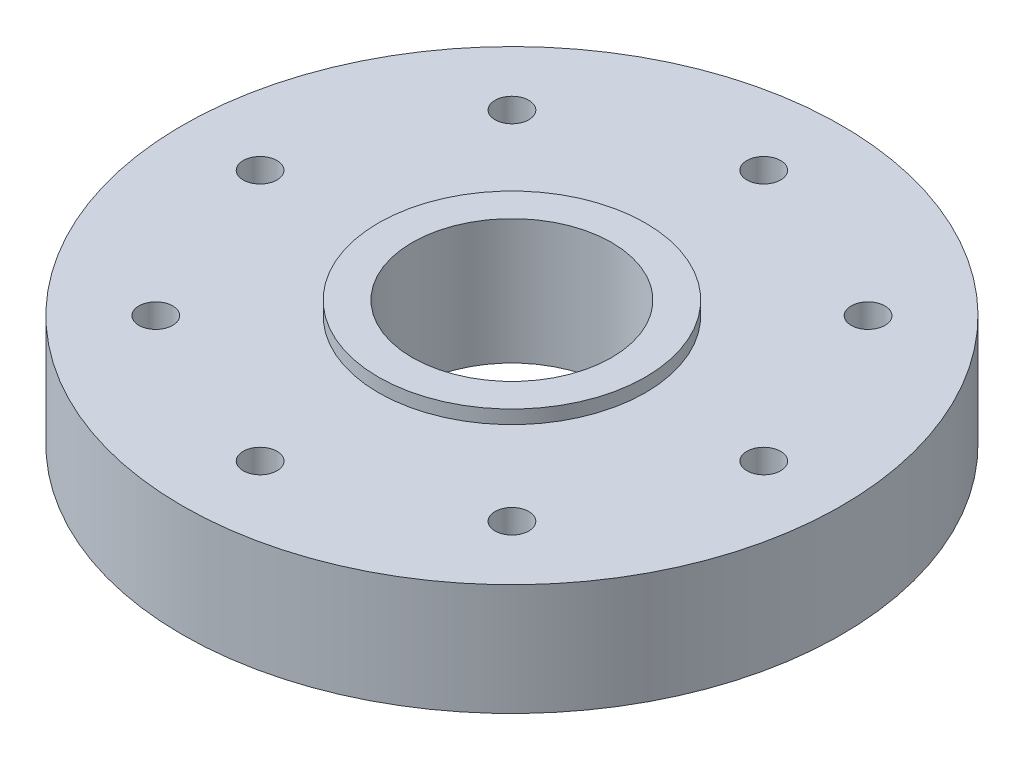
ISO-10303-21;
HEADER;
FILE_DESCRIPTION(('STEP AP214'),'2;1');
FILE_NAME('part.step','',(''),(''),'','','');
FILE_SCHEMA(('AUTOMOTIVE_DESIGN { 1 0 10303 214 1 1 1 1 }'));
ENDSEC;
DATA;
#1=APPLICATION_CONTEXT('core data for automotive mechanical design processes');
#2=APPLICATION_PROTOCOL_DEFINITION('international standard','automotive_design',2000,#1);
#3=PRODUCT_CONTEXT('',#1,'mechanical');
#4=PRODUCT('Part','Part','',(#3));
#5=PRODUCT_RELATED_PRODUCT_CATEGORY('part','',(#4));
#6=PRODUCT_DEFINITION_FORMATION('','',#4);
#7=PRODUCT_DEFINITION_CONTEXT('part definition',#1,'design');
#8=PRODUCT_DEFINITION('design','',#6,#7);
#9=PRODUCT_DEFINITION_SHAPE('','',#8);
#10=(LENGTH_UNIT() NAMED_UNIT(*) SI_UNIT(.MILLI.,.METRE.));
#11=(NAMED_UNIT(*) PLANE_ANGLE_UNIT() SI_UNIT($,.RADIAN.));
#12=(NAMED_UNIT(*) SI_UNIT($,.STERADIAN.) SOLID_ANGLE_UNIT());
#13=UNCERTAINTY_MEASURE_WITH_UNIT(LENGTH_MEASURE(1.E-05),#10,'distance_accuracy_value','');
#14=(GEOMETRIC_REPRESENTATION_CONTEXT(3) GLOBAL_UNCERTAINTY_ASSIGNED_CONTEXT((#13)) GLOBAL_UNIT_ASSIGNED_CONTEXT((#10,
#11,#12)) REPRESENTATION_CONTEXT('',''));
#15=CARTESIAN_POINT('',(0.,0.,0.));
#16=DIRECTION('',(0.,0.,1.));
#17=DIRECTION('',(1.,0.,0.));
#18=AXIS2_PLACEMENT_3D('',#15,#16,#17);
#19=CARTESIAN_POINT('',(0.,3.3,0.));
#20=DIRECTION('',(0.,1.,0.));
#21=DIRECTION('',(0.,0.,1.));
#22=AXIS2_PLACEMENT_3D('',#19,#20,#21);
#23=PLANE('',#22);
#24=CARTESIAN_POINT('',(-5.26794551983972,3.3,-5.26794551983984));
#25=DIRECTION('',(0.,1.,0.));
#26=DIRECTION('',(0.,0.,1.));
#27=AXIS2_PLACEMENT_3D('',#24,#25,#26);
#28=CIRCLE('',#27,0.5);
#29=CARTESIAN_POINT('',(-5.26794551983972,3.3,-4.76794551983984));
#30=VERTEX_POINT('',#29);
#31=EDGE_CURVE('E114',#30,#30,#28,.T.);
#32=ORIENTED_EDGE('',*,*,#31,.F.);
#33=EDGE_LOOP('',(#32));
#34=FACE_BOUND('',#33,.T.);
#35=CARTESIAN_POINT('',(-5.26794551984002,3.3,5.26794551984003));
#36=DIRECTION('',(0.,1.,0.));
#37=DIRECTION('',(0.,0.,1.));
#38=AXIS2_PLACEMENT_3D('',#35,#36,#37);
#39=CIRCLE('',#38,0.499999999999965);
#40=CARTESIAN_POINT('',(-5.26794551984002,3.3,5.76794551983999));
#41=VERTEX_POINT('',#40);
#42=EDGE_CURVE('E98',#41,#41,#39,.T.);
#43=ORIENTED_EDGE('',*,*,#42,.F.);
#44=EDGE_LOOP('',(#43));
#45=FACE_BOUND('',#44,.T.);
#46=CARTESIAN_POINT('',(7.45,3.3,0.));
#47=DIRECTION('',(0.,1.,0.));
#48=DIRECTION('',(0.,0.,1.));
#49=AXIS2_PLACEMENT_3D('',#46,#47,#48);
#50=CIRCLE('',#49,0.5);
#51=CARTESIAN_POINT('',(7.45,3.3,0.500000000000054));
#52=VERTEX_POINT('',#51);
#53=EDGE_CURVE('E82',#52,#52,#50,.T.);
#54=ORIENTED_EDGE('',*,*,#53,.F.);
#55=EDGE_LOOP('',(#54));
#56=FACE_BOUND('',#55,.T.);
#57=CARTESIAN_POINT('',(-1.39151936813873E-13,3.3,7.45000000000035));
#58=DIRECTION('',(0.,1.,0.));
#59=DIRECTION('',(0.,0.,1.));
#60=AXIS2_PLACEMENT_3D('',#57,#58,#59);
#61=CIRCLE('',#60,0.499999999999815);
#62=CARTESIAN_POINT('',(-1.39151936813873E-13,3.3,7.95000000000016));
#63=VERTEX_POINT('',#62);
#64=EDGE_CURVE('E66',#63,#63,#61,.T.);
#65=ORIENTED_EDGE('',*,*,#64,.F.);
#66=EDGE_LOOP('',(#65));
#67=FACE_BOUND('',#66,.T.);
#68=CARTESIAN_POINT('',(0.,3.3,0.));
#69=DIRECTION('',(0.,1.,0.));
#70=DIRECTION('',(0.,0.,1.));
#71=AXIS2_PLACEMENT_3D('',#68,#69,#70);
#72=CIRCLE('',#71,9.75);
#73=CARTESIAN_POINT('',(0.,3.3,9.75));
#74=VERTEX_POINT('',#73);
#75=EDGE_CURVE('E10',#74,#74,#72,.T.);
#76=ORIENTED_EDGE('',*,*,#75,.T.);
#77=EDGE_LOOP('',(#76));
#78=FACE_BOUND('',#77,.T.);
#79=CARTESIAN_POINT('',(0.,3.3,-7.45));
#80=DIRECTION('',(0.,1.,0.));
#81=DIRECTION('',(0.,0.,1.));
#82=AXIS2_PLACEMENT_3D('',#79,#80,#81);
#83=CIRCLE('',#82,0.5);
#84=CARTESIAN_POINT('',(0.,3.3,-6.95));
#85=VERTEX_POINT('',#84);
#86=EDGE_CURVE('E61',#85,#85,#83,.T.);
#87=ORIENTED_EDGE('',*,*,#86,.F.);
#88=EDGE_LOOP('',(#87));
#89=FACE_BOUND('',#88,.T.);
#90=CARTESIAN_POINT('',(5.26794551983988,3.3,-5.26794551983968));
#91=DIRECTION('',(0.,1.,0.));
#92=DIRECTION('',(0.,0.,1.));
#93=AXIS2_PLACEMENT_3D('',#90,#91,#92);
#94=CIRCLE('',#93,0.5);
#95=CARTESIAN_POINT('',(5.26794551983988,3.3,-4.76794551983968));
#96=VERTEX_POINT('',#95);
#97=EDGE_CURVE('E74',#96,#96,#94,.T.);
#98=ORIENTED_EDGE('',*,*,#97,.F.);
#99=EDGE_LOOP('',(#98));
#100=FACE_BOUND('',#99,.T.);
#101=CARTESIAN_POINT('',(5.26794551983978,3.3,5.26794551984012));
#102=DIRECTION('',(0.,1.,0.));
#103=DIRECTION('',(0.,0.,1.));
#104=AXIS2_PLACEMENT_3D('',#101,#102,#103);
#105=CIRCLE('',#104,0.499999999999735);
#106=CARTESIAN_POINT('',(5.26794551983978,3.3,5.76794551983986));
#107=VERTEX_POINT('',#106);
#108=EDGE_CURVE('E90',#107,#107,#105,.T.);
#109=ORIENTED_EDGE('',*,*,#108,.F.);
#110=EDGE_LOOP('',(#109));
#111=FACE_BOUND('',#110,.T.);
#112=CARTESIAN_POINT('',(-7.45000000000024,3.3,1.04667906674207E-13));
#113=DIRECTION('',(0.,1.,0.));
#114=DIRECTION('',(0.,0.,1.));
#115=AXIS2_PLACEMENT_3D('',#112,#113,#114);
#116=CIRCLE('',#115,0.500000000000103);
#117=CARTESIAN_POINT('',(-7.45000000000024,3.3,0.500000000000208));
#118=VERTEX_POINT('',#117);
#119=EDGE_CURVE('E106',#118,#118,#116,.T.);
#120=ORIENTED_EDGE('',*,*,#119,.F.);
#121=EDGE_LOOP('',(#120));
#122=FACE_BOUND('',#121,.T.);
#123=CARTESIAN_POINT('',(0.,3.3,0.));
#124=DIRECTION('',(0.,1.,0.));
#125=DIRECTION('',(0.,0.,1.));
#126=AXIS2_PLACEMENT_3D('',#123,#124,#125);
#127=CIRCLE('',#126,3.95);
#128=CARTESIAN_POINT('',(0.,3.3,3.95));
#129=VERTEX_POINT('',#128);
#130=EDGE_CURVE('E126',#129,#129,#127,.T.);
#131=ORIENTED_EDGE('',*,*,#130,.F.);
#132=EDGE_LOOP('',(#131));
#133=FACE_BOUND('',#132,.T.);
#134=ADVANCED_FACE('F43',(#34,#45,#56,#67,#78,#89,#100,#111,#122,#133),#23,.T.);
#135=CARTESIAN_POINT('',(0.,0.,0.));
#136=DIRECTION('',(0.,1.,0.));
#137=DIRECTION('',(0.,0.,1.));
#138=AXIS2_PLACEMENT_3D('',#135,#136,#137);
#139=PLANE('',#138);
#140=CARTESIAN_POINT('',(0.,0.,0.));
#141=DIRECTION('',(0.,1.,0.));
#142=DIRECTION('',(0.,0.,1.));
#143=AXIS2_PLACEMENT_3D('',#140,#141,#142);
#144=CIRCLE('',#143,9.75);
#145=CARTESIAN_POINT('',(0.,0.,9.75));
#146=VERTEX_POINT('',#145);
#147=EDGE_CURVE('E47',#146,#146,#144,.T.);
#148=ORIENTED_EDGE('',*,*,#147,.F.);
#149=EDGE_LOOP('',(#148));
#150=FACE_BOUND('',#149,.T.);
#151=CARTESIAN_POINT('',(0.,0.,0.));
#152=DIRECTION('',(0.,1.,0.));
#153=DIRECTION('',(0.,0.,1.));
#154=AXIS2_PLACEMENT_3D('',#151,#152,#153);
#155=CIRCLE('',#154,2.95);
#156=CARTESIAN_POINT('',(0.,0.,2.95));
#157=VERTEX_POINT('',#156);
#158=EDGE_CURVE('E56',#157,#157,#155,.T.);
#159=ORIENTED_EDGE('',*,*,#158,.T.);
#160=EDGE_LOOP('',(#159));
#161=FACE_BOUND('',#160,.T.);
#162=CARTESIAN_POINT('',(0.,0.,-7.45));
#163=DIRECTION('',(0.,1.,0.));
#164=DIRECTION('',(0.,0.,1.));
#165=AXIS2_PLACEMENT_3D('',#162,#163,#164);
#166=CIRCLE('',#165,0.5);
#167=CARTESIAN_POINT('',(0.,0.,-6.95));
#168=VERTEX_POINT('',#167);
#169=EDGE_CURVE('E62',#168,#168,#166,.T.);
#170=ORIENTED_EDGE('',*,*,#169,.T.);
#171=EDGE_LOOP('',(#170));
#172=FACE_BOUND('',#171,.T.);
#173=CARTESIAN_POINT('',(-1.39151936813873E-13,0.,7.45000000000035));
#174=DIRECTION('',(0.,1.,0.));
#175=DIRECTION('',(0.,0.,1.));
#176=AXIS2_PLACEMENT_3D('',#173,#174,#175);
#177=CIRCLE('',#176,0.499999999999815);
#178=CARTESIAN_POINT('',(-1.39151936813873E-13,0.,7.95000000000016));
#179=VERTEX_POINT('',#178);
#180=EDGE_CURVE('E70',#179,#179,#177,.T.);
#181=ORIENTED_EDGE('',*,*,#180,.T.);
#182=EDGE_LOOP('',(#181));
#183=FACE_BOUND('',#182,.T.);
#184=CARTESIAN_POINT('',(5.26794551983988,0.,-5.26794551983968));
#185=DIRECTION('',(0.,1.,0.));
#186=DIRECTION('',(0.,0.,1.));
#187=AXIS2_PLACEMENT_3D('',#184,#185,#186);
#188=CIRCLE('',#187,0.5);
#189=CARTESIAN_POINT('',(5.26794551983988,0.,-4.76794551983968));
#190=VERTEX_POINT('',#189);
#191=EDGE_CURVE('E78',#190,#190,#188,.T.);
#192=ORIENTED_EDGE('',*,*,#191,.T.);
#193=EDGE_LOOP('',(#192));
#194=FACE_BOUND('',#193,.T.);
#195=CARTESIAN_POINT('',(7.45,0.,0.));
#196=DIRECTION('',(0.,1.,0.));
#197=DIRECTION('',(0.,0.,1.));
#198=AXIS2_PLACEMENT_3D('',#195,#196,#197);
#199=CIRCLE('',#198,0.5);
#200=CARTESIAN_POINT('',(7.45,0.,0.500000000000054));
#201=VERTEX_POINT('',#200);
#202=EDGE_CURVE('E86',#201,#201,#199,.T.);
#203=ORIENTED_EDGE('',*,*,#202,.T.);
#204=EDGE_LOOP('',(#203));
#205=FACE_BOUND('',#204,.T.);
#206=CARTESIAN_POINT('',(5.26794551983978,0.,5.26794551984012));
#207=DIRECTION('',(0.,1.,0.));
#208=DIRECTION('',(0.,0.,1.));
#209=AXIS2_PLACEMENT_3D('',#206,#207,#208);
#210=CIRCLE('',#209,0.499999999999735);
#211=CARTESIAN_POINT('',(5.26794551983978,0.,5.76794551983986));
#212=VERTEX_POINT('',#211);
#213=EDGE_CURVE('E94',#212,#212,#210,.T.);
#214=ORIENTED_EDGE('',*,*,#213,.T.);
#215=EDGE_LOOP('',(#214));
#216=FACE_BOUND('',#215,.T.);
#217=CARTESIAN_POINT('',(-5.26794551984002,0.,5.26794551984003));
#218=DIRECTION('',(0.,1.,0.));
#219=DIRECTION('',(0.,0.,1.));
#220=AXIS2_PLACEMENT_3D('',#217,#218,#219);
#221=CIRCLE('',#220,0.499999999999965);
#222=CARTESIAN_POINT('',(-5.26794551984002,0.,5.76794551983999));
#223=VERTEX_POINT('',#222);
#224=EDGE_CURVE('E102',#223,#223,#221,.T.);
#225=ORIENTED_EDGE('',*,*,#224,.T.);
#226=EDGE_LOOP('',(#225));
#227=FACE_BOUND('',#226,.T.);
#228=CARTESIAN_POINT('',(-7.45000000000024,0.,1.04667906674207E-13));
#229=DIRECTION('',(0.,1.,0.));
#230=DIRECTION('',(0.,0.,1.));
#231=AXIS2_PLACEMENT_3D('',#228,#229,#230);
#232=CIRCLE('',#231,0.500000000000103);
#233=CARTESIAN_POINT('',(-7.45000000000024,0.,0.500000000000208));
#234=VERTEX_POINT('',#233);
#235=EDGE_CURVE('E110',#234,#234,#232,.T.);
#236=ORIENTED_EDGE('',*,*,#235,.T.);
#237=EDGE_LOOP('',(#236));
#238=FACE_BOUND('',#237,.T.);
#239=CARTESIAN_POINT('',(-5.26794551983972,0.,-5.26794551983984));
#240=DIRECTION('',(0.,1.,0.));
#241=DIRECTION('',(0.,0.,1.));
#242=AXIS2_PLACEMENT_3D('',#239,#240,#241);
#243=CIRCLE('',#242,0.5);
#244=CARTESIAN_POINT('',(-5.26794551983972,0.,-4.76794551983984));
#245=VERTEX_POINT('',#244);
#246=EDGE_CURVE('E118',#245,#245,#243,.T.);
#247=ORIENTED_EDGE('',*,*,#246,.T.);
#248=EDGE_LOOP('',(#247));
#249=FACE_BOUND('',#248,.T.);
#250=ADVANCED_FACE('F157',(#150,#161,#172,#183,#194,#205,#216,#227,#238,#249),#139,.F.);
#251=CARTESIAN_POINT('',(0.,3.3,0.));
#252=DIRECTION('',(0.,-1.,0.));
#253=DIRECTION('',(0.,0.,-1.));
#254=AXIS2_PLACEMENT_3D('',#251,#252,#253);
#255=CYLINDRICAL_SURFACE('',#254,9.75);
#256=ORIENTED_EDGE('',*,*,#75,.F.);
#257=EDGE_LOOP('',(#256));
#258=FACE_BOUND('',#257,.T.);
#259=ORIENTED_EDGE('',*,*,#147,.T.);
#260=EDGE_LOOP('',(#259));
#261=FACE_BOUND('',#260,.T.);
#262=ADVANCED_FACE('F45',(#258,#261),#255,.T.);
#263=CARTESIAN_POINT('',(0.,3.3,0.));
#264=DIRECTION('',(0.,-1.,0.));
#265=DIRECTION('',(0.,0.,-1.));
#266=AXIS2_PLACEMENT_3D('',#263,#264,#265);
#267=CYLINDRICAL_SURFACE('',#266,2.95);
#268=ORIENTED_EDGE('',*,*,#158,.F.);
#269=EDGE_LOOP('',(#268));
#270=FACE_BOUND('',#269,.T.);
#271=CARTESIAN_POINT('',(0.,3.7,0.));
#272=DIRECTION('',(0.,1.,0.));
#273=DIRECTION('',(0.,0.,1.));
#274=AXIS2_PLACEMENT_3D('',#271,#272,#273);
#275=CIRCLE('',#274,2.95);
#276=CARTESIAN_POINT('',(0.,3.7,2.95));
#277=VERTEX_POINT('',#276);
#278=EDGE_CURVE('E130',#277,#277,#275,.T.);
#279=ORIENTED_EDGE('',*,*,#278,.T.);
#280=EDGE_LOOP('',(#279));
#281=FACE_BOUND('',#280,.T.);
#282=ADVANCED_FACE('F138',(#270,#281),#267,.F.);
#283=CARTESIAN_POINT('',(0.,3.3,-7.45));
#284=DIRECTION('',(0.,-1.,0.));
#285=DIRECTION('',(0.,0.,-1.));
#286=AXIS2_PLACEMENT_3D('',#283,#284,#285);
#287=CYLINDRICAL_SURFACE('',#286,0.5);
#288=ORIENTED_EDGE('',*,*,#86,.T.);
#289=EDGE_LOOP('',(#288));
#290=FACE_BOUND('',#289,.T.);
#291=ORIENTED_EDGE('',*,*,#169,.F.);
#292=EDGE_LOOP('',(#291));
#293=FACE_BOUND('',#292,.T.);
#294=ADVANCED_FACE('F168',(#290,#293),#287,.F.);
#295=CARTESIAN_POINT('',(-1.39151936813873E-13,3.3,7.45000000000035));
#296=DIRECTION('',(0.,-1.,0.));
#297=DIRECTION('',(0.,0.,-1.));
#298=AXIS2_PLACEMENT_3D('',#295,#296,#297);
#299=CYLINDRICAL_SURFACE('',#298,0.499999999999815);
#300=ORIENTED_EDGE('',*,*,#64,.T.);
#301=EDGE_LOOP('',(#300));
#302=FACE_BOUND('',#301,.T.);
#303=ORIENTED_EDGE('',*,*,#180,.F.);
#304=EDGE_LOOP('',(#303));
#305=FACE_BOUND('',#304,.T.);
#306=ADVANCED_FACE('F172',(#302,#305),#299,.F.);
#307=CARTESIAN_POINT('',(5.26794551983988,3.3,-5.26794551983968));
#308=DIRECTION('',(0.,-1.,0.));
#309=DIRECTION('',(0.,0.,-1.));
#310=AXIS2_PLACEMENT_3D('',#307,#308,#309);
#311=CYLINDRICAL_SURFACE('',#310,0.5);
#312=ORIENTED_EDGE('',*,*,#97,.T.);
#313=EDGE_LOOP('',(#312));
#314=FACE_BOUND('',#313,.T.);
#315=ORIENTED_EDGE('',*,*,#191,.F.);
#316=EDGE_LOOP('',(#315));
#317=FACE_BOUND('',#316,.T.);
#318=ADVANCED_FACE('F176',(#314,#317),#311,.F.);
#319=CARTESIAN_POINT('',(7.45,3.3,0.));
#320=DIRECTION('',(0.,-1.,0.));
#321=DIRECTION('',(0.,0.,-1.));
#322=AXIS2_PLACEMENT_3D('',#319,#320,#321);
#323=CYLINDRICAL_SURFACE('',#322,0.5);
#324=ORIENTED_EDGE('',*,*,#53,.T.);
#325=EDGE_LOOP('',(#324));
#326=FACE_BOUND('',#325,.T.);
#327=ORIENTED_EDGE('',*,*,#202,.F.);
#328=EDGE_LOOP('',(#327));
#329=FACE_BOUND('',#328,.T.);
#330=ADVANCED_FACE('F180',(#326,#329),#323,.F.);
#331=CARTESIAN_POINT('',(5.26794551983978,3.3,5.26794551984012));
#332=DIRECTION('',(0.,-1.,0.));
#333=DIRECTION('',(0.,0.,-1.));
#334=AXIS2_PLACEMENT_3D('',#331,#332,#333);
#335=CYLINDRICAL_SURFACE('',#334,0.499999999999735);
#336=ORIENTED_EDGE('',*,*,#108,.T.);
#337=EDGE_LOOP('',(#336));
#338=FACE_BOUND('',#337,.T.);
#339=ORIENTED_EDGE('',*,*,#213,.F.);
#340=EDGE_LOOP('',(#339));
#341=FACE_BOUND('',#340,.T.);
#342=ADVANCED_FACE('F184',(#338,#341),#335,.F.);
#343=CARTESIAN_POINT('',(-5.26794551984002,3.3,5.26794551984003));
#344=DIRECTION('',(0.,-1.,0.));
#345=DIRECTION('',(0.,0.,-1.));
#346=AXIS2_PLACEMENT_3D('',#343,#344,#345);
#347=CYLINDRICAL_SURFACE('',#346,0.499999999999965);
#348=ORIENTED_EDGE('',*,*,#42,.T.);
#349=EDGE_LOOP('',(#348));
#350=FACE_BOUND('',#349,.T.);
#351=ORIENTED_EDGE('',*,*,#224,.F.);
#352=EDGE_LOOP('',(#351));
#353=FACE_BOUND('',#352,.T.);
#354=ADVANCED_FACE('F188',(#350,#353),#347,.F.);
#355=CARTESIAN_POINT('',(-7.45000000000024,3.3,1.04667906674207E-13));
#356=DIRECTION('',(0.,-1.,0.));
#357=DIRECTION('',(0.,0.,-1.));
#358=AXIS2_PLACEMENT_3D('',#355,#356,#357);
#359=CYLINDRICAL_SURFACE('',#358,0.500000000000103);
#360=ORIENTED_EDGE('',*,*,#119,.T.);
#361=EDGE_LOOP('',(#360));
#362=FACE_BOUND('',#361,.T.);
#363=ORIENTED_EDGE('',*,*,#235,.F.);
#364=EDGE_LOOP('',(#363));
#365=FACE_BOUND('',#364,.T.);
#366=ADVANCED_FACE('F153',(#362,#365),#359,.F.);
#367=CARTESIAN_POINT('',(-5.26794551983972,3.3,-5.26794551983984));
#368=DIRECTION('',(0.,-1.,0.));
#369=DIRECTION('',(0.,0.,-1.));
#370=AXIS2_PLACEMENT_3D('',#367,#368,#369);
#371=CYLINDRICAL_SURFACE('',#370,0.5);
#372=ORIENTED_EDGE('',*,*,#31,.T.);
#373=EDGE_LOOP('',(#372));
#374=FACE_BOUND('',#373,.T.);
#375=ORIENTED_EDGE('',*,*,#246,.F.);
#376=EDGE_LOOP('',(#375));
#377=FACE_BOUND('',#376,.T.);
#378=ADVANCED_FACE('F143',(#374,#377),#371,.F.);
#379=CARTESIAN_POINT('',(0.,3.7,0.));
#380=DIRECTION('',(0.,1.,0.));
#381=DIRECTION('',(0.,0.,1.));
#382=AXIS2_PLACEMENT_3D('',#379,#380,#381);
#383=PLANE('',#382);
#384=CARTESIAN_POINT('',(0.,3.7,0.));
#385=DIRECTION('',(0.,1.,0.));
#386=DIRECTION('',(0.,0.,1.));
#387=AXIS2_PLACEMENT_3D('',#384,#385,#386);
#388=CIRCLE('',#387,3.95);
#389=CARTESIAN_POINT('',(0.,3.7,3.95));
#390=VERTEX_POINT('',#389);
#391=EDGE_CURVE('E122',#390,#390,#388,.T.);
#392=ORIENTED_EDGE('',*,*,#391,.T.);
#393=EDGE_LOOP('',(#392));
#394=FACE_BOUND('',#393,.T.);
#395=ORIENTED_EDGE('',*,*,#278,.F.);
#396=EDGE_LOOP('',(#395));
#397=FACE_BOUND('',#396,.T.);
#398=ADVANCED_FACE('F140',(#394,#397),#383,.T.);
#399=CARTESIAN_POINT('',(0.,3.7,0.));
#400=DIRECTION('',(0.,-1.,0.));
#401=DIRECTION('',(0.,0.,-1.));
#402=AXIS2_PLACEMENT_3D('',#399,#400,#401);
#403=CYLINDRICAL_SURFACE('',#402,3.95);
#404=ORIENTED_EDGE('',*,*,#391,.F.);
#405=EDGE_LOOP('',(#404));
#406=FACE_BOUND('',#405,.T.);
#407=ORIENTED_EDGE('',*,*,#130,.T.);
#408=EDGE_LOOP('',(#407));
#409=FACE_BOUND('',#408,.T.);
#410=ADVANCED_FACE('F142',(#406,#409),#403,.T.);
#411=CLOSED_SHELL('',(#134,#250,#262,#282,#294,#306,#318,#330,#342,#354,#366,#378,#398,#410));
#412=MANIFOLD_SOLID_BREP('B2',#411);
#413=ADVANCED_BREP_SHAPE_REPRESENTATION('',(#18,#412),#14);
#414=SHAPE_DEFINITION_REPRESENTATION(#9,#413);
ENDSEC;
END-ISO-10303-21;
